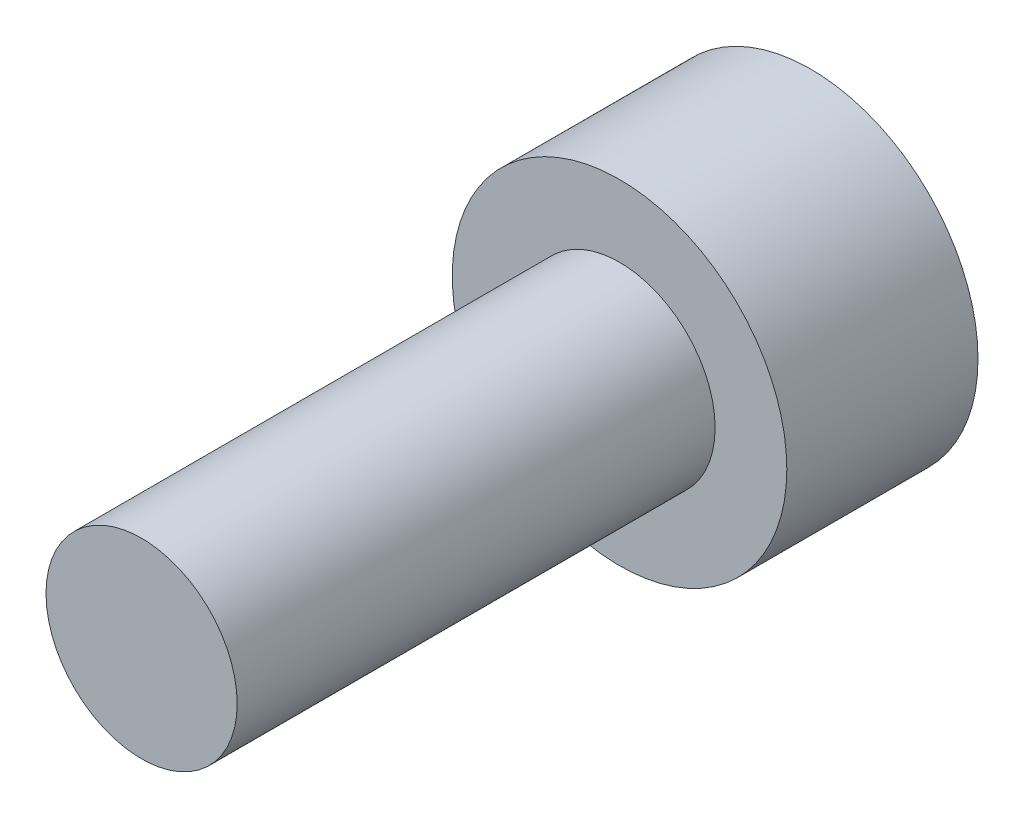
ISO-10303-21;
HEADER;
FILE_DESCRIPTION(('STEP AP214'),'2;1');
FILE_NAME('part.step','',(''),(''),'','','');
FILE_SCHEMA(('AUTOMOTIVE_DESIGN { 1 0 10303 214 1 1 1 1 }'));
ENDSEC;
DATA;
#1=APPLICATION_CONTEXT('core data for automotive mechanical design processes');
#2=APPLICATION_PROTOCOL_DEFINITION('international standard','automotive_design',2000,#1);
#3=PRODUCT_CONTEXT('',#1,'mechanical');
#4=PRODUCT('Part','Part','',(#3));
#5=PRODUCT_RELATED_PRODUCT_CATEGORY('part','',(#4));
#6=PRODUCT_DEFINITION_FORMATION('','',#4);
#7=PRODUCT_DEFINITION_CONTEXT('part definition',#1,'design');
#8=PRODUCT_DEFINITION('design','',#6,#7);
#9=PRODUCT_DEFINITION_SHAPE('','',#8);
#10=(LENGTH_UNIT() NAMED_UNIT(*) SI_UNIT(.MILLI.,.METRE.));
#11=(NAMED_UNIT(*) PLANE_ANGLE_UNIT() SI_UNIT($,.RADIAN.));
#12=(NAMED_UNIT(*) SI_UNIT($,.STERADIAN.) SOLID_ANGLE_UNIT());
#13=UNCERTAINTY_MEASURE_WITH_UNIT(LENGTH_MEASURE(1.E-05),#10,'distance_accuracy_value','');
#14=(GEOMETRIC_REPRESENTATION_CONTEXT(3) GLOBAL_UNCERTAINTY_ASSIGNED_CONTEXT((#13)) GLOBAL_UNIT_ASSIGNED_CONTEXT((#10,
#11,#12)) REPRESENTATION_CONTEXT('',''));
#15=CARTESIAN_POINT('',(0.,0.,0.));
#16=DIRECTION('',(0.,0.,1.));
#17=DIRECTION('',(1.,0.,0.));
#18=AXIS2_PLACEMENT_3D('',#15,#16,#17);
#19=CARTESIAN_POINT('',(0.,0.,4.));
#20=DIRECTION('',(0.,0.,1.));
#21=DIRECTION('',(1.,0.,0.));
#22=AXIS2_PLACEMENT_3D('',#19,#20,#21);
#23=PLANE('',#22);
#24=CARTESIAN_POINT('',(0.,0.,4.));
#25=DIRECTION('',(0.,0.,1.));
#26=DIRECTION('',(1.,0.,0.));
#27=AXIS2_PLACEMENT_3D('',#24,#25,#26);
#28=CIRCLE('',#27,3.5);
#29=CARTESIAN_POINT('',(3.5,0.,4.));
#30=VERTEX_POINT('',#29);
#31=EDGE_CURVE('E11',#30,#30,#28,.T.);
#32=ORIENTED_EDGE('',*,*,#31,.T.);
#33=EDGE_LOOP('',(#32));
#34=FACE_BOUND('',#33,.T.);
#35=CARTESIAN_POINT('',(0.,0.,4.));
#36=DIRECTION('',(0.,0.,1.));
#37=DIRECTION('',(1.,0.,0.));
#38=AXIS2_PLACEMENT_3D('',#35,#36,#37);
#39=CIRCLE('',#38,2.);
#40=CARTESIAN_POINT('',(2.,0.,4.));
#41=VERTEX_POINT('',#40);
#42=EDGE_CURVE('E139',#41,#41,#39,.T.);
#43=ORIENTED_EDGE('',*,*,#42,.F.);
#44=EDGE_LOOP('',(#43));
#45=FACE_BOUND('',#44,.T.);
#46=ADVANCED_FACE('F37',(#34,#45),#23,.T.);
#47=CARTESIAN_POINT('',(0.,0.,4.));
#48=DIRECTION('',(0.,0.,-1.));
#49=DIRECTION('',(-1.,0.,0.));
#50=AXIS2_PLACEMENT_3D('',#47,#48,#49);
#51=CYLINDRICAL_SURFACE('',#50,3.5);
#52=ORIENTED_EDGE('',*,*,#31,.F.);
#53=EDGE_LOOP('',(#52));
#54=FACE_BOUND('',#53,.T.);
#55=CARTESIAN_POINT('',(0.,0.,0.));
#56=DIRECTION('',(0.,0.,1.));
#57=DIRECTION('',(1.,0.,0.));
#58=AXIS2_PLACEMENT_3D('',#55,#56,#57);
#59=CIRCLE('',#58,3.5);
#60=CARTESIAN_POINT('',(3.5,0.,0.));
#61=VERTEX_POINT('',#60);
#62=EDGE_CURVE('E41',#61,#61,#59,.T.);
#63=ORIENTED_EDGE('',*,*,#62,.T.);
#64=EDGE_LOOP('',(#63));
#65=FACE_BOUND('',#64,.T.);
#66=ADVANCED_FACE('F39',(#54,#65),#51,.T.);
#67=CARTESIAN_POINT('',(0.,0.,0.));
#68=DIRECTION('',(0.,0.,1.));
#69=DIRECTION('',(1.,0.,0.));
#70=AXIS2_PLACEMENT_3D('',#67,#68,#69);
#71=PLANE('',#70);
#72=DIRECTION('',(0.016679700977843,0.99986088411103,0.));
#73=VECTOR('',#72,1.);
#74=CARTESIAN_POINT('',(-1.70410249793918,-0.946321786040356,0.));
#75=LINE('',#74,#73);
#76=CARTESIAN_POINT('',(-1.70410249793918,-0.946321786040356,0.));
#77=VERTEX_POINT('',#76);
#78=CARTESIAN_POINT('',(-1.6715899558352,1.00263516084767,0.));
#79=VERTEX_POINT('',#78);
#80=EDGE_CURVE('E126',#77,#79,#75,.T.);
#81=ORIENTED_EDGE('',*,*,#80,.F.);
#82=DIRECTION('',(-0.857565075401599,0.514375486829855,0.));
#83=VECTOR('',#82,1.);
#84=CARTESIAN_POINT('',(-0.0325125421039786,-1.94895694688803,0.));
#85=LINE('',#84,#83);
#86=CARTESIAN_POINT('',(-0.0325125421039786,-1.94895694688803,0.));
#87=VERTEX_POINT('',#86);
#88=EDGE_CURVE('E52',#87,#77,#85,.T.);
#89=ORIENTED_EDGE('',*,*,#88,.F.);
#90=DIRECTION('',(-0.874244776379441,-0.485485397281175,0.));
#91=VECTOR('',#90,1.);
#92=CARTESIAN_POINT('',(1.6715899558352,-1.00263516084767,0.));
#93=LINE('',#92,#91);
#94=CARTESIAN_POINT('',(1.6715899558352,-1.00263516084767,0.));
#95=VERTEX_POINT('',#94);
#96=EDGE_CURVE('E135',#95,#87,#93,.T.);
#97=ORIENTED_EDGE('',*,*,#96,.F.);
#98=DIRECTION('',(-0.0166797009778428,-0.99986088411103,0.));
#99=VECTOR('',#98,1.);
#100=CARTESIAN_POINT('',(1.70410249793918,0.946321786040357,0.));
#101=LINE('',#100,#99);
#102=CARTESIAN_POINT('',(1.70410249793918,0.946321786040357,0.));
#103=VERTEX_POINT('',#102);
#104=EDGE_CURVE('E133',#103,#95,#101,.T.);
#105=ORIENTED_EDGE('',*,*,#104,.F.);
#106=DIRECTION('',(0.857565075401599,-0.514375486829855,0.));
#107=VECTOR('',#106,1.);
#108=CARTESIAN_POINT('',(0.0325125421039795,1.94895694688803,0.));
#109=LINE('',#108,#107);
#110=CARTESIAN_POINT('',(0.0325125421039795,1.94895694688803,0.));
#111=VERTEX_POINT('',#110);
#112=EDGE_CURVE('E100',#111,#103,#109,.T.);
#113=ORIENTED_EDGE('',*,*,#112,.F.);
#114=DIRECTION('',(0.874244776379442,0.485485397281175,0.));
#115=VECTOR('',#114,1.);
#116=CARTESIAN_POINT('',(-1.6715899558352,1.00263516084767,0.));
#117=LINE('',#116,#115);
#118=EDGE_CURVE('E129',#79,#111,#117,.T.);
#119=ORIENTED_EDGE('',*,*,#118,.F.);
#120=EDGE_LOOP('',(#81,#89,#97,#105,#113,#119));
#121=FACE_BOUND('',#120,.T.);
#122=ORIENTED_EDGE('',*,*,#62,.F.);
#123=EDGE_LOOP('',(#122));
#124=FACE_BOUND('',#123,.T.);
#125=ADVANCED_FACE('F159',(#121,#124),#71,.F.);
#126=CARTESIAN_POINT('',(0.,0.,14.));
#127=DIRECTION('',(0.,0.,-1.));
#128=DIRECTION('',(-1.,0.,0.));
#129=AXIS2_PLACEMENT_3D('',#126,#127,#128);
#130=CYLINDRICAL_SURFACE('',#129,2.);
#131=CARTESIAN_POINT('',(0.,0.,14.));
#132=DIRECTION('',(0.,0.,1.));
#133=DIRECTION('',(1.,0.,0.));
#134=AXIS2_PLACEMENT_3D('',#131,#132,#133);
#135=CIRCLE('',#134,2.);
#136=CARTESIAN_POINT('',(2.,0.,14.));
#137=VERTEX_POINT('',#136);
#138=EDGE_CURVE('E145',#137,#137,#135,.T.);
#139=ORIENTED_EDGE('',*,*,#138,.F.);
#140=EDGE_LOOP('',(#139));
#141=FACE_BOUND('',#140,.T.);
#142=ORIENTED_EDGE('',*,*,#42,.T.);
#143=EDGE_LOOP('',(#142));
#144=FACE_BOUND('',#143,.T.);
#145=ADVANCED_FACE('F151',(#141,#144),#130,.T.);
#146=CARTESIAN_POINT('',(0.,0.,14.));
#147=DIRECTION('',(0.,0.,1.));
#148=DIRECTION('',(1.,0.,0.));
#149=AXIS2_PLACEMENT_3D('',#146,#147,#148);
#150=PLANE('',#149);
#151=ORIENTED_EDGE('',*,*,#138,.T.);
#152=EDGE_LOOP('',(#151));
#153=FACE_BOUND('',#152,.T.);
#154=ADVANCED_FACE('F168',(#153),#150,.T.);
#155=CARTESIAN_POINT('',(-0.0325125421039786,-1.94895694688803,2.));
#156=DIRECTION('',(-0.514375486829855,-0.857565075401599,0.));
#157=DIRECTION('',(0.857565075401599,-0.514375486829855,0.));
#158=AXIS2_PLACEMENT_3D('',#155,#156,#157);
#159=PLANE('',#158);
#160=ORIENTED_EDGE('',*,*,#88,.T.);
#161=DIRECTION('',(0.,0.,-1.));
#162=VECTOR('',#161,1.);
#163=CARTESIAN_POINT('',(-1.70410249793918,-0.946321786040356,2.));
#164=LINE('',#163,#162);
#165=CARTESIAN_POINT('',(-1.70410249793918,-0.946321786040356,2.));
#166=VERTEX_POINT('',#165);
#167=EDGE_CURVE('E82',#166,#77,#164,.T.);
#168=ORIENTED_EDGE('',*,*,#167,.F.);
#169=DIRECTION('',(-0.857565075401599,0.514375486829855,0.));
#170=VECTOR('',#169,1.);
#171=CARTESIAN_POINT('',(-0.0325125421039786,-1.94895694688803,2.));
#172=LINE('',#171,#170);
#173=CARTESIAN_POINT('',(-0.0325125421039786,-1.94895694688803,2.));
#174=VERTEX_POINT('',#173);
#175=EDGE_CURVE('E137',#174,#166,#172,.T.);
#176=ORIENTED_EDGE('',*,*,#175,.F.);
#177=DIRECTION('',(0.,0.,-1.));
#178=VECTOR('',#177,1.);
#179=CARTESIAN_POINT('',(-0.0325125421039786,-1.94895694688803,2.));
#180=LINE('',#179,#178);
#181=EDGE_CURVE('E60',#174,#87,#180,.T.);
#182=ORIENTED_EDGE('',*,*,#181,.T.);
#183=EDGE_LOOP('',(#160,#168,#176,#182));
#184=FACE_BOUND('',#183,.T.);
#185=ADVANCED_FACE('F180',(#184),#159,.F.);
#186=CARTESIAN_POINT('',(1.6715899558352,-1.00263516084767,2.));
#187=DIRECTION('',(0.485485397281175,-0.874244776379442,0.));
#188=DIRECTION('',(0.874244776379442,0.485485397281175,0.));
#189=AXIS2_PLACEMENT_3D('',#186,#187,#188);
#190=PLANE('',#189);
#191=ORIENTED_EDGE('',*,*,#96,.T.);
#192=ORIENTED_EDGE('',*,*,#181,.F.);
#193=DIRECTION('',(-0.874244776379441,-0.485485397281175,0.));
#194=VECTOR('',#193,1.);
#195=CARTESIAN_POINT('',(1.6715899558352,-1.00263516084767,2.));
#196=LINE('',#195,#194);
#197=CARTESIAN_POINT('',(1.6715899558352,-1.00263516084767,2.));
#198=VERTEX_POINT('',#197);
#199=EDGE_CURVE('E112',#198,#174,#196,.T.);
#200=ORIENTED_EDGE('',*,*,#199,.F.);
#201=DIRECTION('',(0.,0.,-1.));
#202=VECTOR('',#201,1.);
#203=CARTESIAN_POINT('',(1.6715899558352,-1.00263516084767,2.));
#204=LINE('',#203,#202);
#205=EDGE_CURVE('E104',#198,#95,#204,.T.);
#206=ORIENTED_EDGE('',*,*,#205,.T.);
#207=EDGE_LOOP('',(#191,#192,#200,#206));
#208=FACE_BOUND('',#207,.T.);
#209=ADVANCED_FACE('F182',(#208),#190,.F.);
#210=CARTESIAN_POINT('',(1.70410249793918,0.946321786040357,2.));
#211=DIRECTION('',(0.99986088411103,-0.0166797009778428,0.));
#212=DIRECTION('',(0.0166797009778428,0.99986088411103,0.));
#213=AXIS2_PLACEMENT_3D('',#210,#211,#212);
#214=PLANE('',#213);
#215=ORIENTED_EDGE('',*,*,#104,.T.);
#216=ORIENTED_EDGE('',*,*,#205,.F.);
#217=DIRECTION('',(-0.0166797009778428,-0.99986088411103,0.));
#218=VECTOR('',#217,1.);
#219=CARTESIAN_POINT('',(1.70410249793918,0.946321786040357,2.));
#220=LINE('',#219,#218);
#221=CARTESIAN_POINT('',(1.70410249793918,0.946321786040357,2.));
#222=VERTEX_POINT('',#221);
#223=EDGE_CURVE('E108',#222,#198,#220,.T.);
#224=ORIENTED_EDGE('',*,*,#223,.F.);
#225=DIRECTION('',(0.,0.,-1.));
#226=VECTOR('',#225,1.);
#227=CARTESIAN_POINT('',(1.70410249793918,0.946321786040357,2.));
#228=LINE('',#227,#226);
#229=EDGE_CURVE('E93',#222,#103,#228,.T.);
#230=ORIENTED_EDGE('',*,*,#229,.T.);
#231=EDGE_LOOP('',(#215,#216,#224,#230));
#232=FACE_BOUND('',#231,.T.);
#233=ADVANCED_FACE('F109',(#232),#214,.F.);
#234=CARTESIAN_POINT('',(0.0325125421039795,1.94895694688803,2.));
#235=DIRECTION('',(0.514375486829855,0.857565075401599,0.));
#236=DIRECTION('',(-0.857565075401599,0.514375486829855,0.));
#237=AXIS2_PLACEMENT_3D('',#234,#235,#236);
#238=PLANE('',#237);
#239=ORIENTED_EDGE('',*,*,#112,.T.);
#240=ORIENTED_EDGE('',*,*,#229,.F.);
#241=DIRECTION('',(0.857565075401599,-0.514375486829855,0.));
#242=VECTOR('',#241,1.);
#243=CARTESIAN_POINT('',(0.0325125421039795,1.94895694688803,2.));
#244=LINE('',#243,#242);
#245=CARTESIAN_POINT('',(0.0325125421039795,1.94895694688803,2.));
#246=VERTEX_POINT('',#245);
#247=EDGE_CURVE('E97',#246,#222,#244,.T.);
#248=ORIENTED_EDGE('',*,*,#247,.F.);
#249=DIRECTION('',(0.,0.,-1.));
#250=VECTOR('',#249,1.);
#251=CARTESIAN_POINT('',(0.0325125421039795,1.94895694688803,2.));
#252=LINE('',#251,#250);
#253=EDGE_CURVE('E105',#246,#111,#252,.T.);
#254=ORIENTED_EDGE('',*,*,#253,.T.);
#255=EDGE_LOOP('',(#239,#240,#248,#254));
#256=FACE_BOUND('',#255,.T.);
#257=ADVANCED_FACE('F95',(#256),#238,.F.);
#258=CARTESIAN_POINT('',(-1.6715899558352,1.00263516084767,2.));
#259=DIRECTION('',(-0.485485397281175,0.874244776379442,0.));
#260=DIRECTION('',(-0.874244776379442,-0.485485397281175,0.));
#261=AXIS2_PLACEMENT_3D('',#258,#259,#260);
#262=PLANE('',#261);
#263=ORIENTED_EDGE('',*,*,#118,.T.);
#264=ORIENTED_EDGE('',*,*,#253,.F.);
#265=DIRECTION('',(0.874244776379442,0.485485397281175,0.));
#266=VECTOR('',#265,1.);
#267=CARTESIAN_POINT('',(-1.6715899558352,1.00263516084767,2.));
#268=LINE('',#267,#266);
#269=CARTESIAN_POINT('',(-1.6715899558352,1.00263516084767,2.));
#270=VERTEX_POINT('',#269);
#271=EDGE_CURVE('E118',#270,#246,#268,.T.);
#272=ORIENTED_EDGE('',*,*,#271,.F.);
#273=DIRECTION('',(0.,0.,-1.));
#274=VECTOR('',#273,1.);
#275=CARTESIAN_POINT('',(-1.6715899558352,1.00263516084767,2.));
#276=LINE('',#275,#274);
#277=EDGE_CURVE('E142',#270,#79,#276,.T.);
#278=ORIENTED_EDGE('',*,*,#277,.T.);
#279=EDGE_LOOP('',(#263,#264,#272,#278));
#280=FACE_BOUND('',#279,.T.);
#281=ADVANCED_FACE('F193',(#280),#262,.F.);
#282=CARTESIAN_POINT('',(-1.70410249793918,-0.946321786040356,2.));
#283=DIRECTION('',(-0.99986088411103,0.016679700977843,0.));
#284=DIRECTION('',(-0.016679700977843,-0.99986088411103,0.));
#285=AXIS2_PLACEMENT_3D('',#282,#283,#284);
#286=PLANE('',#285);
#287=ORIENTED_EDGE('',*,*,#80,.T.);
#288=ORIENTED_EDGE('',*,*,#277,.F.);
#289=DIRECTION('',(0.016679700977843,0.99986088411103,0.));
#290=VECTOR('',#289,1.);
#291=CARTESIAN_POINT('',(-1.70410249793918,-0.946321786040356,2.));
#292=LINE('',#291,#290);
#293=EDGE_CURVE('E120',#166,#270,#292,.T.);
#294=ORIENTED_EDGE('',*,*,#293,.F.);
#295=ORIENTED_EDGE('',*,*,#167,.T.);
#296=EDGE_LOOP('',(#287,#288,#294,#295));
#297=FACE_BOUND('',#296,.T.);
#298=ADVANCED_FACE('F178',(#297),#286,.F.);
#299=CARTESIAN_POINT('',(0.,0.,2.));
#300=DIRECTION('',(0.,0.,-1.));
#301=DIRECTION('',(-1.,0.,0.));
#302=AXIS2_PLACEMENT_3D('',#299,#300,#301);
#303=PLANE('',#302);
#304=ORIENTED_EDGE('',*,*,#175,.T.);
#305=ORIENTED_EDGE('',*,*,#293,.T.);
#306=ORIENTED_EDGE('',*,*,#271,.T.);
#307=ORIENTED_EDGE('',*,*,#247,.T.);
#308=ORIENTED_EDGE('',*,*,#223,.T.);
#309=ORIENTED_EDGE('',*,*,#199,.T.);
#310=EDGE_LOOP('',(#304,#305,#306,#307,#308,#309));
#311=FACE_BOUND('',#310,.T.);
#312=ADVANCED_FACE('F115',(#311),#303,.T.);
#313=CLOSED_SHELL('',(#46,#66,#125,#145,#154,#185,#209,#233,#257,#281,#298,#312));
#314=MANIFOLD_SOLID_BREP('B2',#313);
#315=ADVANCED_BREP_SHAPE_REPRESENTATION('',(#18,#314),#14);
#316=SHAPE_DEFINITION_REPRESENTATION(#9,#315);
ENDSEC;
END-ISO-10303-21;
